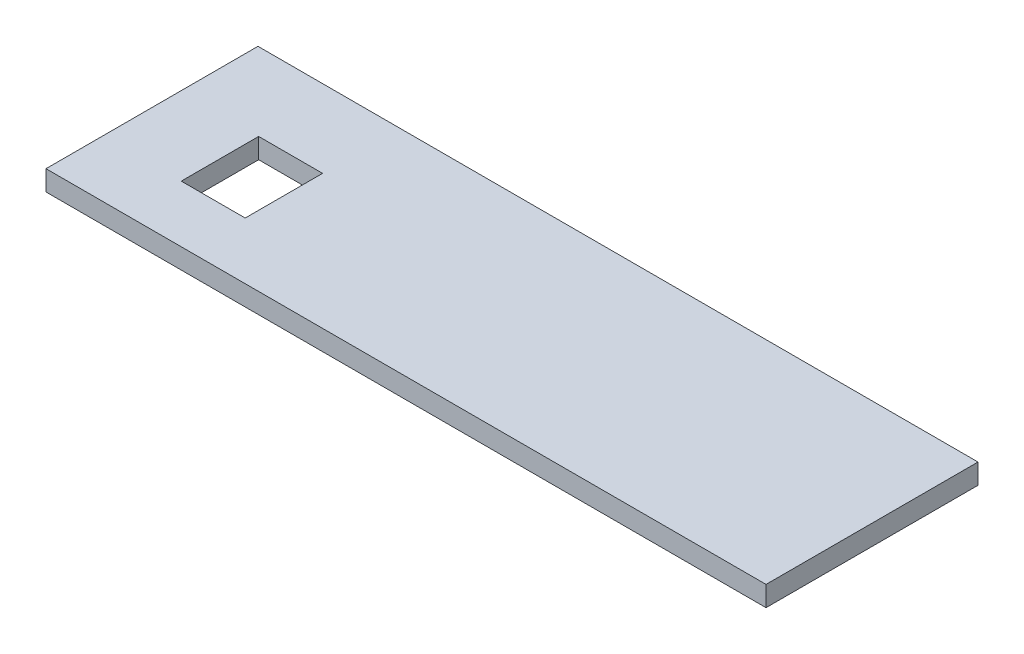
ISO-10303-21;
HEADER;
FILE_DESCRIPTION(('STEP AP214'),'2;1');
FILE_NAME('part.step','',(''),(''),'','','');
FILE_SCHEMA(('AUTOMOTIVE_DESIGN { 1 0 10303 214 1 1 1 1 }'));
ENDSEC;
DATA;
#1=APPLICATION_CONTEXT('core data for automotive mechanical design processes');
#2=APPLICATION_PROTOCOL_DEFINITION('international standard','automotive_design',2000,#1);
#3=PRODUCT_CONTEXT('',#1,'mechanical');
#4=PRODUCT('Part','Part','',(#3));
#5=PRODUCT_RELATED_PRODUCT_CATEGORY('part','',(#4));
#6=PRODUCT_DEFINITION_FORMATION('','',#4);
#7=PRODUCT_DEFINITION_CONTEXT('part definition',#1,'design');
#8=PRODUCT_DEFINITION('design','',#6,#7);
#9=PRODUCT_DEFINITION_SHAPE('','',#8);
#10=(LENGTH_UNIT() NAMED_UNIT(*) SI_UNIT(.MILLI.,.METRE.));
#11=(NAMED_UNIT(*) PLANE_ANGLE_UNIT() SI_UNIT($,.RADIAN.));
#12=(NAMED_UNIT(*) SI_UNIT($,.STERADIAN.) SOLID_ANGLE_UNIT());
#13=UNCERTAINTY_MEASURE_WITH_UNIT(LENGTH_MEASURE(1.E-05),#10,'distance_accuracy_value','');
#14=(GEOMETRIC_REPRESENTATION_CONTEXT(3) GLOBAL_UNCERTAINTY_ASSIGNED_CONTEXT((#13)) GLOBAL_UNIT_ASSIGNED_CONTEXT((#10,
#11,#12)) REPRESENTATION_CONTEXT('',''));
#15=CARTESIAN_POINT('',(0.,0.,0.));
#16=DIRECTION('',(0.,0.,1.));
#17=DIRECTION('',(1.,0.,0.));
#18=AXIS2_PLACEMENT_3D('',#15,#16,#17);
#19=CARTESIAN_POINT('',(0.,3.,0.));
#20=DIRECTION('',(0.,-1.,0.));
#21=DIRECTION('',(0.,0.,-1.));
#22=AXIS2_PLACEMENT_3D('',#19,#20,#21);
#23=PLANE('',#22);
#24=DIRECTION('',(0.,0.,1.));
#25=VECTOR('',#24,1.);
#26=CARTESIAN_POINT('',(0.,3.,31.5));
#27=LINE('',#26,#25);
#28=CARTESIAN_POINT('',(0.,3.,0.));
#29=VERTEX_POINT('',#28);
#30=CARTESIAN_POINT('',(0.,3.,31.5));
#31=VERTEX_POINT('',#30);
#32=EDGE_CURVE('E142',#29,#31,#27,.T.);
#33=ORIENTED_EDGE('',*,*,#32,.T.);
#34=DIRECTION('',(1.,0.,0.));
#35=VECTOR('',#34,1.);
#36=CARTESIAN_POINT('',(0.,3.,31.5));
#37=LINE('',#36,#35);
#38=CARTESIAN_POINT('',(107.,3.,31.5));
#39=VERTEX_POINT('',#38);
#40=EDGE_CURVE('E145',#31,#39,#37,.T.);
#41=ORIENTED_EDGE('',*,*,#40,.T.);
#42=DIRECTION('',(0.,0.,-1.));
#43=VECTOR('',#42,1.);
#44=CARTESIAN_POINT('',(107.,3.,31.5));
#45=LINE('',#44,#43);
#46=CARTESIAN_POINT('',(107.,3.,0.));
#47=VERTEX_POINT('',#46);
#48=EDGE_CURVE('E148',#39,#47,#45,.T.);
#49=ORIENTED_EDGE('',*,*,#48,.T.);
#50=DIRECTION('',(-1.,0.,0.));
#51=VECTOR('',#50,1.);
#52=CARTESIAN_POINT('',(0.,3.,0.));
#53=LINE('',#52,#51);
#54=EDGE_CURVE('E150',#47,#29,#53,.T.);
#55=ORIENTED_EDGE('',*,*,#54,.T.);
#56=EDGE_LOOP('',(#33,#41,#49,#55));
#57=FACE_BOUND('',#56,.T.);
#58=DIRECTION('',(0.,0.,1.));
#59=VECTOR('',#58,1.);
#60=CARTESIAN_POINT('',(11.65,3.,23.05));
#61=LINE('',#60,#59);
#62=CARTESIAN_POINT('',(11.65,3.,11.55));
#63=VERTEX_POINT('',#62);
#64=CARTESIAN_POINT('',(11.65,3.,23.05));
#65=VERTEX_POINT('',#64);
#66=EDGE_CURVE('E106',#63,#65,#61,.T.);
#67=ORIENTED_EDGE('',*,*,#66,.F.);
#68=DIRECTION('',(-1.,0.,0.));
#69=VECTOR('',#68,1.);
#70=CARTESIAN_POINT('',(11.65,3.,11.55));
#71=LINE('',#70,#69);
#72=CARTESIAN_POINT('',(21.15,3.,11.55));
#73=VERTEX_POINT('',#72);
#74=EDGE_CURVE('E128',#73,#63,#71,.T.);
#75=ORIENTED_EDGE('',*,*,#74,.F.);
#76=DIRECTION('',(0.,0.,-1.));
#77=VECTOR('',#76,1.);
#78=CARTESIAN_POINT('',(21.15,3.,23.05));
#79=LINE('',#78,#77);
#80=CARTESIAN_POINT('',(21.15,3.,23.05));
#81=VERTEX_POINT('',#80);
#82=EDGE_CURVE('E126',#81,#73,#79,.T.);
#83=ORIENTED_EDGE('',*,*,#82,.F.);
#84=DIRECTION('',(1.,0.,0.));
#85=VECTOR('',#84,1.);
#86=CARTESIAN_POINT('',(11.65,3.,23.05));
#87=LINE('',#86,#85);
#88=EDGE_CURVE('E114',#65,#81,#87,.T.);
#89=ORIENTED_EDGE('',*,*,#88,.F.);
#90=EDGE_LOOP('',(#67,#75,#83,#89));
#91=FACE_BOUND('',#90,.T.);
#92=ADVANCED_FACE('F41',(#57,#91),#23,.F.);
#93=CARTESIAN_POINT('',(0.,0.,0.));
#94=DIRECTION('',(0.,-1.,0.));
#95=DIRECTION('',(0.,0.,-1.));
#96=AXIS2_PLACEMENT_3D('',#93,#94,#95);
#97=PLANE('',#96);
#98=DIRECTION('',(0.,0.,1.));
#99=VECTOR('',#98,1.);
#100=CARTESIAN_POINT('',(0.,0.,31.5));
#101=LINE('',#100,#99);
#102=CARTESIAN_POINT('',(0.,0.,0.));
#103=VERTEX_POINT('',#102);
#104=CARTESIAN_POINT('',(0.,0.,31.5));
#105=VERTEX_POINT('',#104);
#106=EDGE_CURVE('E122',#103,#105,#101,.T.);
#107=ORIENTED_EDGE('',*,*,#106,.F.);
#108=DIRECTION('',(-1.,0.,0.));
#109=VECTOR('',#108,1.);
#110=CARTESIAN_POINT('',(0.,0.,0.));
#111=LINE('',#110,#109);
#112=CARTESIAN_POINT('',(107.,0.,0.));
#113=VERTEX_POINT('',#112);
#114=EDGE_CURVE('E146',#113,#103,#111,.T.);
#115=ORIENTED_EDGE('',*,*,#114,.F.);
#116=DIRECTION('',(0.,0.,-1.));
#117=VECTOR('',#116,1.);
#118=CARTESIAN_POINT('',(107.,0.,31.5));
#119=LINE('',#118,#117);
#120=CARTESIAN_POINT('',(107.,0.,31.5));
#121=VERTEX_POINT('',#120);
#122=EDGE_CURVE('E157',#121,#113,#119,.T.);
#123=ORIENTED_EDGE('',*,*,#122,.F.);
#124=DIRECTION('',(1.,0.,0.));
#125=VECTOR('',#124,1.);
#126=CARTESIAN_POINT('',(0.,0.,31.5));
#127=LINE('',#126,#125);
#128=EDGE_CURVE('E155',#105,#121,#127,.T.);
#129=ORIENTED_EDGE('',*,*,#128,.F.);
#130=EDGE_LOOP('',(#107,#115,#123,#129));
#131=FACE_BOUND('',#130,.T.);
#132=DIRECTION('',(-1.,0.,0.));
#133=VECTOR('',#132,1.);
#134=CARTESIAN_POINT('',(11.65,0.,11.55));
#135=LINE('',#134,#133);
#136=CARTESIAN_POINT('',(21.15,0.,11.55));
#137=VERTEX_POINT('',#136);
#138=CARTESIAN_POINT('',(11.65,0.,11.55));
#139=VERTEX_POINT('',#138);
#140=EDGE_CURVE('E115',#137,#139,#135,.T.);
#141=ORIENTED_EDGE('',*,*,#140,.T.);
#142=DIRECTION('',(0.,0.,1.));
#143=VECTOR('',#142,1.);
#144=CARTESIAN_POINT('',(11.65,0.,23.05));
#145=LINE('',#144,#143);
#146=CARTESIAN_POINT('',(11.65,0.,23.05));
#147=VERTEX_POINT('',#146);
#148=EDGE_CURVE('E64',#139,#147,#145,.T.);
#149=ORIENTED_EDGE('',*,*,#148,.T.);
#150=DIRECTION('',(1.,0.,0.));
#151=VECTOR('',#150,1.);
#152=CARTESIAN_POINT('',(11.65,0.,23.05));
#153=LINE('',#152,#151);
#154=CARTESIAN_POINT('',(21.15,0.,23.05));
#155=VERTEX_POINT('',#154);
#156=EDGE_CURVE('E121',#147,#155,#153,.T.);
#157=ORIENTED_EDGE('',*,*,#156,.T.);
#158=DIRECTION('',(0.,0.,-1.));
#159=VECTOR('',#158,1.);
#160=CARTESIAN_POINT('',(21.15,0.,23.05));
#161=LINE('',#160,#159);
#162=EDGE_CURVE('E134',#155,#137,#161,.T.);
#163=ORIENTED_EDGE('',*,*,#162,.T.);
#164=EDGE_LOOP('',(#141,#149,#157,#163));
#165=FACE_BOUND('',#164,.T.);
#166=ADVANCED_FACE('F175',(#131,#165),#97,.T.);
#167=CARTESIAN_POINT('',(0.,3.,31.5));
#168=DIRECTION('',(1.,0.,0.));
#169=DIRECTION('',(0.,0.,-1.));
#170=AXIS2_PLACEMENT_3D('',#167,#168,#169);
#171=PLANE('',#170);
#172=ORIENTED_EDGE('',*,*,#106,.T.);
#173=DIRECTION('',(0.,-1.,0.));
#174=VECTOR('',#173,1.);
#175=CARTESIAN_POINT('',(0.,3.,31.5));
#176=LINE('',#175,#174);
#177=EDGE_CURVE('E11',#31,#105,#176,.T.);
#178=ORIENTED_EDGE('',*,*,#177,.F.);
#179=ORIENTED_EDGE('',*,*,#32,.F.);
#180=DIRECTION('',(0.,-1.,0.));
#181=VECTOR('',#180,1.);
#182=CARTESIAN_POINT('',(0.,3.,0.));
#183=LINE('',#182,#181);
#184=EDGE_CURVE('E152',#29,#103,#183,.T.);
#185=ORIENTED_EDGE('',*,*,#184,.T.);
#186=EDGE_LOOP('',(#172,#178,#179,#185));
#187=FACE_BOUND('',#186,.T.);
#188=ADVANCED_FACE('F43',(#187),#171,.F.);
#189=CARTESIAN_POINT('',(0.,3.,31.5));
#190=DIRECTION('',(0.,0.,-1.));
#191=DIRECTION('',(-1.,0.,0.));
#192=AXIS2_PLACEMENT_3D('',#189,#190,#191);
#193=PLANE('',#192);
#194=ORIENTED_EDGE('',*,*,#128,.T.);
#195=DIRECTION('',(0.,-1.,0.));
#196=VECTOR('',#195,1.);
#197=CARTESIAN_POINT('',(107.,3.,31.5));
#198=LINE('',#197,#196);
#199=EDGE_CURVE('E49',#39,#121,#198,.T.);
#200=ORIENTED_EDGE('',*,*,#199,.F.);
#201=ORIENTED_EDGE('',*,*,#40,.F.);
#202=ORIENTED_EDGE('',*,*,#177,.T.);
#203=EDGE_LOOP('',(#194,#200,#201,#202));
#204=FACE_BOUND('',#203,.T.);
#205=ADVANCED_FACE('F185',(#204),#193,.F.);
#206=CARTESIAN_POINT('',(107.,3.,31.5));
#207=DIRECTION('',(-1.,0.,0.));
#208=DIRECTION('',(0.,0.,1.));
#209=AXIS2_PLACEMENT_3D('',#206,#207,#208);
#210=PLANE('',#209);
#211=ORIENTED_EDGE('',*,*,#122,.T.);
#212=DIRECTION('',(0.,-1.,0.));
#213=VECTOR('',#212,1.);
#214=CARTESIAN_POINT('',(107.,3.,0.));
#215=LINE('',#214,#213);
#216=EDGE_CURVE('E162',#47,#113,#215,.T.);
#217=ORIENTED_EDGE('',*,*,#216,.F.);
#218=ORIENTED_EDGE('',*,*,#48,.F.);
#219=ORIENTED_EDGE('',*,*,#199,.T.);
#220=EDGE_LOOP('',(#211,#217,#218,#219));
#221=FACE_BOUND('',#220,.T.);
#222=ADVANCED_FACE('F169',(#221),#210,.F.);
#223=CARTESIAN_POINT('',(0.,3.,0.));
#224=DIRECTION('',(0.,0.,1.));
#225=DIRECTION('',(1.,0.,0.));
#226=AXIS2_PLACEMENT_3D('',#223,#224,#225);
#227=PLANE('',#226);
#228=ORIENTED_EDGE('',*,*,#114,.T.);
#229=ORIENTED_EDGE('',*,*,#184,.F.);
#230=ORIENTED_EDGE('',*,*,#54,.F.);
#231=ORIENTED_EDGE('',*,*,#216,.T.);
#232=EDGE_LOOP('',(#228,#229,#230,#231));
#233=FACE_BOUND('',#232,.T.);
#234=ADVANCED_FACE('F179',(#233),#227,.F.);
#235=CARTESIAN_POINT('',(11.65,3.,23.05));
#236=DIRECTION('',(1.,0.,0.));
#237=DIRECTION('',(0.,0.,-1.));
#238=AXIS2_PLACEMENT_3D('',#235,#236,#237);
#239=PLANE('',#238);
#240=ORIENTED_EDGE('',*,*,#148,.F.);
#241=DIRECTION('',(0.,-1.,0.));
#242=VECTOR('',#241,1.);
#243=CARTESIAN_POINT('',(11.65,3.,11.55));
#244=LINE('',#243,#242);
#245=EDGE_CURVE('E110',#63,#139,#244,.T.);
#246=ORIENTED_EDGE('',*,*,#245,.F.);
#247=ORIENTED_EDGE('',*,*,#66,.T.);
#248=DIRECTION('',(0.,-1.,0.));
#249=VECTOR('',#248,1.);
#250=CARTESIAN_POINT('',(11.65,3.,23.05));
#251=LINE('',#250,#249);
#252=EDGE_CURVE('E109',#65,#147,#251,.T.);
#253=ORIENTED_EDGE('',*,*,#252,.T.);
#254=EDGE_LOOP('',(#240,#246,#247,#253));
#255=FACE_BOUND('',#254,.T.);
#256=ADVANCED_FACE('F108',(#255),#239,.T.);
#257=CARTESIAN_POINT('',(11.65,3.,23.05));
#258=DIRECTION('',(0.,0.,-1.));
#259=DIRECTION('',(-1.,0.,0.));
#260=AXIS2_PLACEMENT_3D('',#257,#258,#259);
#261=PLANE('',#260);
#262=ORIENTED_EDGE('',*,*,#156,.F.);
#263=ORIENTED_EDGE('',*,*,#252,.F.);
#264=ORIENTED_EDGE('',*,*,#88,.T.);
#265=DIRECTION('',(0.,-1.,0.));
#266=VECTOR('',#265,1.);
#267=CARTESIAN_POINT('',(21.15,3.,23.05));
#268=LINE('',#267,#266);
#269=EDGE_CURVE('E123',#81,#155,#268,.T.);
#270=ORIENTED_EDGE('',*,*,#269,.T.);
#271=EDGE_LOOP('',(#262,#263,#264,#270));
#272=FACE_BOUND('',#271,.T.);
#273=ADVANCED_FACE('F118',(#272),#261,.T.);
#274=CARTESIAN_POINT('',(21.15,3.,23.05));
#275=DIRECTION('',(-1.,0.,0.));
#276=DIRECTION('',(0.,0.,1.));
#277=AXIS2_PLACEMENT_3D('',#274,#275,#276);
#278=PLANE('',#277);
#279=ORIENTED_EDGE('',*,*,#162,.F.);
#280=ORIENTED_EDGE('',*,*,#269,.F.);
#281=ORIENTED_EDGE('',*,*,#82,.T.);
#282=DIRECTION('',(0.,-1.,0.));
#283=VECTOR('',#282,1.);
#284=CARTESIAN_POINT('',(21.15,3.,11.55));
#285=LINE('',#284,#283);
#286=EDGE_CURVE('E56',#73,#137,#285,.T.);
#287=ORIENTED_EDGE('',*,*,#286,.T.);
#288=EDGE_LOOP('',(#279,#280,#281,#287));
#289=FACE_BOUND('',#288,.T.);
#290=ADVANCED_FACE('F208',(#289),#278,.T.);
#291=CARTESIAN_POINT('',(11.65,3.,11.55));
#292=DIRECTION('',(0.,0.,1.));
#293=DIRECTION('',(1.,0.,0.));
#294=AXIS2_PLACEMENT_3D('',#291,#292,#293);
#295=PLANE('',#294);
#296=ORIENTED_EDGE('',*,*,#140,.F.);
#297=ORIENTED_EDGE('',*,*,#286,.F.);
#298=ORIENTED_EDGE('',*,*,#74,.T.);
#299=ORIENTED_EDGE('',*,*,#245,.T.);
#300=EDGE_LOOP('',(#296,#297,#298,#299));
#301=FACE_BOUND('',#300,.T.);
#302=ADVANCED_FACE('F212',(#301),#295,.T.);
#303=CLOSED_SHELL('',(#92,#166,#188,#205,#222,#234,#256,#273,#290,#302));
#304=MANIFOLD_SOLID_BREP('B2',#303);
#305=ADVANCED_BREP_SHAPE_REPRESENTATION('',(#18,#304),#14);
#306=SHAPE_DEFINITION_REPRESENTATION(#9,#305);
ENDSEC;
END-ISO-10303-21;
